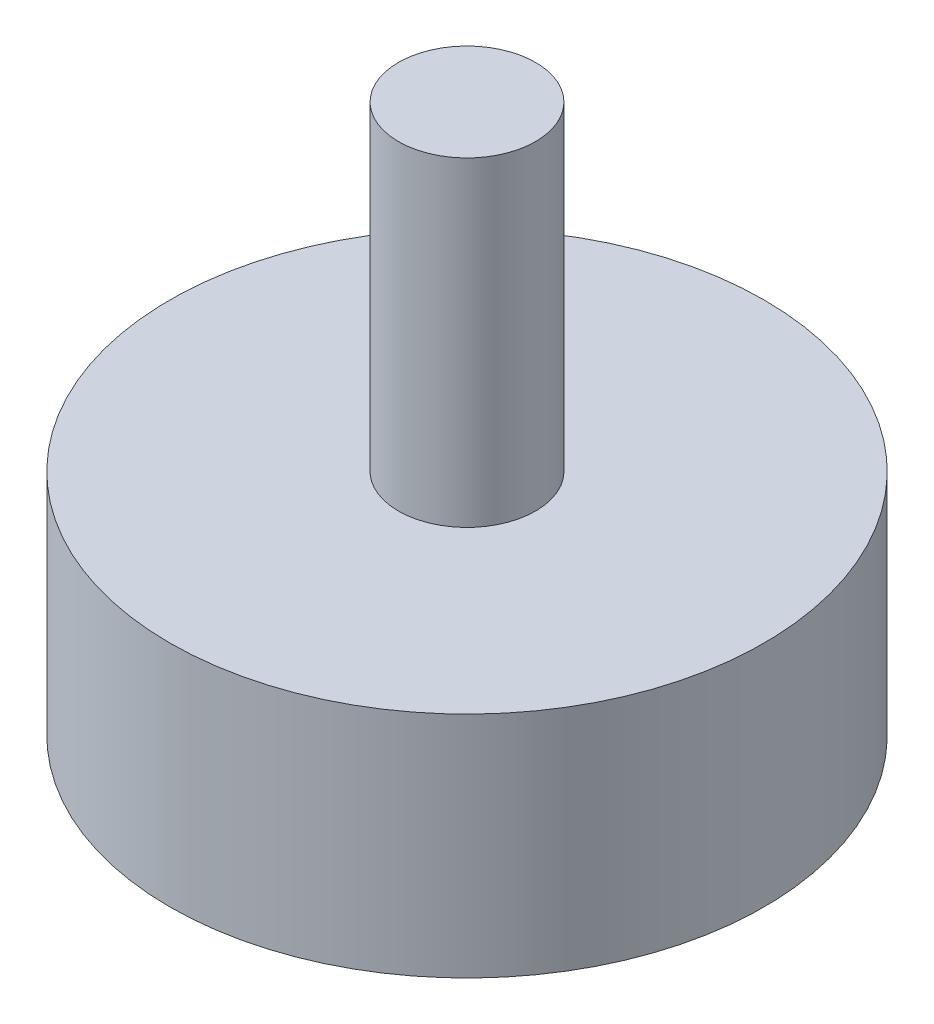
ISO-10303-21;
HEADER;
FILE_DESCRIPTION(('STEP AP214'),'2;1');
FILE_NAME('part.step','',(''),(''),'','','');
FILE_SCHEMA(('AUTOMOTIVE_DESIGN { 1 0 10303 214 1 1 1 1 }'));
ENDSEC;
DATA;
#1=APPLICATION_CONTEXT('core data for automotive mechanical design processes');
#2=APPLICATION_PROTOCOL_DEFINITION('international standard','automotive_design',2000,#1);
#3=PRODUCT_CONTEXT('',#1,'mechanical');
#4=PRODUCT('Part','Part','',(#3));
#5=PRODUCT_RELATED_PRODUCT_CATEGORY('part','',(#4));
#6=PRODUCT_DEFINITION_FORMATION('','',#4);
#7=PRODUCT_DEFINITION_CONTEXT('part definition',#1,'design');
#8=PRODUCT_DEFINITION('design','',#6,#7);
#9=PRODUCT_DEFINITION_SHAPE('','',#8);
#10=(LENGTH_UNIT() NAMED_UNIT(*) SI_UNIT(.MILLI.,.METRE.));
#11=(NAMED_UNIT(*) PLANE_ANGLE_UNIT() SI_UNIT($,.RADIAN.));
#12=(NAMED_UNIT(*) SI_UNIT($,.STERADIAN.) SOLID_ANGLE_UNIT());
#13=UNCERTAINTY_MEASURE_WITH_UNIT(LENGTH_MEASURE(1.E-05),#10,'distance_accuracy_value','');
#14=(GEOMETRIC_REPRESENTATION_CONTEXT(3) GLOBAL_UNCERTAINTY_ASSIGNED_CONTEXT((#13)) GLOBAL_UNIT_ASSIGNED_CONTEXT((#10,
#11,#12)) REPRESENTATION_CONTEXT('',''));
#15=CARTESIAN_POINT('',(0.,0.,0.));
#16=DIRECTION('',(0.,0.,1.));
#17=DIRECTION('',(1.,0.,0.));
#18=AXIS2_PLACEMENT_3D('',#15,#16,#17);
#19=CARTESIAN_POINT('',(0.,5.,0.));
#20=DIRECTION('',(0.,-1.,0.));
#21=DIRECTION('',(0.,0.,-1.));
#22=AXIS2_PLACEMENT_3D('',#19,#20,#21);
#23=CYLINDRICAL_SURFACE('',#22,6.5);
#24=CARTESIAN_POINT('',(0.,5.,0.));
#25=DIRECTION('',(0.,1.,0.));
#26=DIRECTION('',(0.,0.,1.));
#27=AXIS2_PLACEMENT_3D('',#24,#25,#26);
#28=CIRCLE('',#27,6.5);
#29=CARTESIAN_POINT('',(0.,5.,6.5));
#30=VERTEX_POINT('',#29);
#31=EDGE_CURVE('E10',#30,#30,#28,.T.);
#32=ORIENTED_EDGE('',*,*,#31,.F.);
#33=EDGE_LOOP('',(#32));
#34=FACE_BOUND('',#33,.T.);
#35=CARTESIAN_POINT('',(0.,0.,0.));
#36=DIRECTION('',(0.,1.,0.));
#37=DIRECTION('',(0.,0.,1.));
#38=AXIS2_PLACEMENT_3D('',#35,#36,#37);
#39=CIRCLE('',#38,6.5);
#40=CARTESIAN_POINT('',(0.,0.,6.5));
#41=VERTEX_POINT('',#40);
#42=EDGE_CURVE('E33',#41,#41,#39,.T.);
#43=ORIENTED_EDGE('',*,*,#42,.T.);
#44=EDGE_LOOP('',(#43));
#45=FACE_BOUND('',#44,.T.);
#46=ADVANCED_FACE('F30',(#34,#45),#23,.T.);
#47=CARTESIAN_POINT('',(0.,5.,0.));
#48=DIRECTION('',(0.,1.,0.));
#49=DIRECTION('',(0.,0.,1.));
#50=AXIS2_PLACEMENT_3D('',#47,#48,#49);
#51=PLANE('',#50);
#52=CARTESIAN_POINT('',(0.,5.,0.));
#53=DIRECTION('',(0.,1.,0.));
#54=DIRECTION('',(0.,0.,1.));
#55=AXIS2_PLACEMENT_3D('',#52,#53,#54);
#56=CIRCLE('',#55,1.5);
#57=CARTESIAN_POINT('',(0.,5.,1.5));
#58=VERTEX_POINT('',#57);
#59=EDGE_CURVE('E42',#58,#58,#56,.T.);
#60=ORIENTED_EDGE('',*,*,#59,.F.);
#61=EDGE_LOOP('',(#60));
#62=FACE_BOUND('',#61,.T.);
#63=ORIENTED_EDGE('',*,*,#31,.T.);
#64=EDGE_LOOP('',(#63));
#65=FACE_BOUND('',#64,.T.);
#66=ADVANCED_FACE('F57',(#62,#65),#51,.T.);
#67=CARTESIAN_POINT('',(0.,0.,0.));
#68=DIRECTION('',(0.,1.,0.));
#69=DIRECTION('',(0.,0.,1.));
#70=AXIS2_PLACEMENT_3D('',#67,#68,#69);
#71=PLANE('',#70);
#72=ORIENTED_EDGE('',*,*,#42,.F.);
#73=EDGE_LOOP('',(#72));
#74=FACE_BOUND('',#73,.T.);
#75=ADVANCED_FACE('F53',(#74),#71,.F.);
#76=CARTESIAN_POINT('',(0.,12.,0.));
#77=DIRECTION('',(0.,-1.,0.));
#78=DIRECTION('',(0.,0.,-1.));
#79=AXIS2_PLACEMENT_3D('',#76,#77,#78);
#80=CYLINDRICAL_SURFACE('',#79,1.5);
#81=CARTESIAN_POINT('',(0.,12.,0.));
#82=DIRECTION('',(0.,1.,0.));
#83=DIRECTION('',(0.,0.,1.));
#84=AXIS2_PLACEMENT_3D('',#81,#82,#83);
#85=CIRCLE('',#84,1.5);
#86=CARTESIAN_POINT('',(0.,12.,1.5));
#87=VERTEX_POINT('',#86);
#88=EDGE_CURVE('E40',#87,#87,#85,.T.);
#89=ORIENTED_EDGE('',*,*,#88,.F.);
#90=EDGE_LOOP('',(#89));
#91=FACE_BOUND('',#90,.T.);
#92=ORIENTED_EDGE('',*,*,#59,.T.);
#93=EDGE_LOOP('',(#92));
#94=FACE_BOUND('',#93,.T.);
#95=ADVANCED_FACE('F50',(#91,#94),#80,.T.);
#96=CARTESIAN_POINT('',(0.,12.,0.));
#97=DIRECTION('',(0.,1.,0.));
#98=DIRECTION('',(0.,0.,1.));
#99=AXIS2_PLACEMENT_3D('',#96,#97,#98);
#100=PLANE('',#99);
#101=ORIENTED_EDGE('',*,*,#88,.T.);
#102=EDGE_LOOP('',(#101));
#103=FACE_BOUND('',#102,.T.);
#104=ADVANCED_FACE('F48',(#103),#100,.T.);
#105=CLOSED_SHELL('',(#46,#66,#75,#95,#104));
#106=MANIFOLD_SOLID_BREP('B2',#105);
#107=ADVANCED_BREP_SHAPE_REPRESENTATION('',(#18,#106),#14);
#108=SHAPE_DEFINITION_REPRESENTATION(#9,#107);
ENDSEC;
END-ISO-10303-21;
